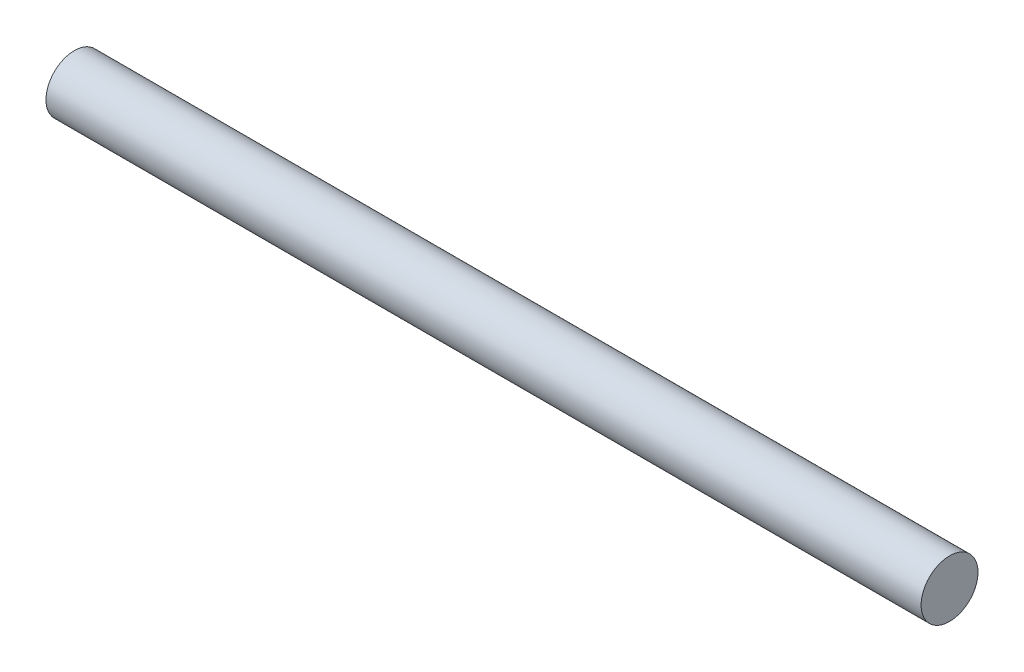
ISO-10303-21;
HEADER;
FILE_DESCRIPTION(('STEP AP214'),'2;1');
FILE_NAME('part.step','',(''),(''),'','','');
FILE_SCHEMA(('AUTOMOTIVE_DESIGN { 1 0 10303 214 1 1 1 1 }'));
ENDSEC;
DATA;
#1=APPLICATION_CONTEXT('core data for automotive mechanical design processes');
#2=APPLICATION_PROTOCOL_DEFINITION('international standard','automotive_design',2000,#1);
#3=PRODUCT_CONTEXT('',#1,'mechanical');
#4=PRODUCT('Part','Part','',(#3));
#5=PRODUCT_RELATED_PRODUCT_CATEGORY('part','',(#4));
#6=PRODUCT_DEFINITION_FORMATION('','',#4);
#7=PRODUCT_DEFINITION_CONTEXT('part definition',#1,'design');
#8=PRODUCT_DEFINITION('design','',#6,#7);
#9=PRODUCT_DEFINITION_SHAPE('','',#8);
#10=(LENGTH_UNIT() NAMED_UNIT(*) SI_UNIT(.MILLI.,.METRE.));
#11=(NAMED_UNIT(*) PLANE_ANGLE_UNIT() SI_UNIT($,.RADIAN.));
#12=(NAMED_UNIT(*) SI_UNIT($,.STERADIAN.) SOLID_ANGLE_UNIT());
#13=UNCERTAINTY_MEASURE_WITH_UNIT(LENGTH_MEASURE(1.E-05),#10,'distance_accuracy_value','');
#14=(GEOMETRIC_REPRESENTATION_CONTEXT(3) GLOBAL_UNCERTAINTY_ASSIGNED_CONTEXT((#13)) GLOBAL_UNIT_ASSIGNED_CONTEXT((#10,
#11,#12)) REPRESENTATION_CONTEXT('',''));
#15=CARTESIAN_POINT('',(0.,0.,0.));
#16=DIRECTION('',(0.,0.,1.));
#17=DIRECTION('',(1.,0.,0.));
#18=AXIS2_PLACEMENT_3D('',#15,#16,#17);
#19=CARTESIAN_POINT('',(200.,0.,0.));
#20=DIRECTION('',(-1.,0.,0.));
#21=DIRECTION('',(0.,0.,1.));
#22=AXIS2_PLACEMENT_3D('',#19,#20,#21);
#23=CYLINDRICAL_SURFACE('',#22,6.5);
#24=CARTESIAN_POINT('',(200.,0.,0.));
#25=DIRECTION('',(1.,0.,0.));
#26=DIRECTION('',(0.,0.,-1.));
#27=AXIS2_PLACEMENT_3D('',#24,#25,#26);
#28=CIRCLE('',#27,6.5);
#29=CARTESIAN_POINT('',(200.,0.,-6.5));
#30=VERTEX_POINT('',#29);
#31=EDGE_CURVE('E10',#30,#30,#28,.T.);
#32=ORIENTED_EDGE('',*,*,#31,.F.);
#33=EDGE_LOOP('',(#32));
#34=FACE_BOUND('',#33,.T.);
#35=CARTESIAN_POINT('',(0.,0.,0.));
#36=DIRECTION('',(1.,0.,0.));
#37=DIRECTION('',(0.,0.,-1.));
#38=AXIS2_PLACEMENT_3D('',#35,#36,#37);
#39=CIRCLE('',#38,6.5);
#40=CARTESIAN_POINT('',(0.,0.,-6.5));
#41=VERTEX_POINT('',#40);
#42=EDGE_CURVE('E34',#41,#41,#39,.T.);
#43=ORIENTED_EDGE('',*,*,#42,.T.);
#44=EDGE_LOOP('',(#43));
#45=FACE_BOUND('',#44,.T.);
#46=ADVANCED_FACE('F31',(#34,#45),#23,.T.);
#47=CARTESIAN_POINT('',(200.,0.,0.));
#48=DIRECTION('',(1.,0.,0.));
#49=DIRECTION('',(0.,0.,-1.));
#50=AXIS2_PLACEMENT_3D('',#47,#48,#49);
#51=PLANE('',#50);
#52=ORIENTED_EDGE('',*,*,#31,.T.);
#53=EDGE_LOOP('',(#52));
#54=FACE_BOUND('',#53,.T.);
#55=ADVANCED_FACE('F46',(#54),#51,.T.);
#56=CARTESIAN_POINT('',(0.,0.,0.));
#57=DIRECTION('',(1.,0.,0.));
#58=DIRECTION('',(0.,0.,-1.));
#59=AXIS2_PLACEMENT_3D('',#56,#57,#58);
#60=PLANE('',#59);
#61=ORIENTED_EDGE('',*,*,#42,.F.);
#62=EDGE_LOOP('',(#61));
#63=FACE_BOUND('',#62,.T.);
#64=ADVANCED_FACE('F44',(#63),#60,.F.);
#65=CLOSED_SHELL('',(#46,#55,#64));
#66=MANIFOLD_SOLID_BREP('B2',#65);
#67=ADVANCED_BREP_SHAPE_REPRESENTATION('',(#18,#66),#14);
#68=SHAPE_DEFINITION_REPRESENTATION(#9,#67);
ENDSEC;
END-ISO-10303-21;
